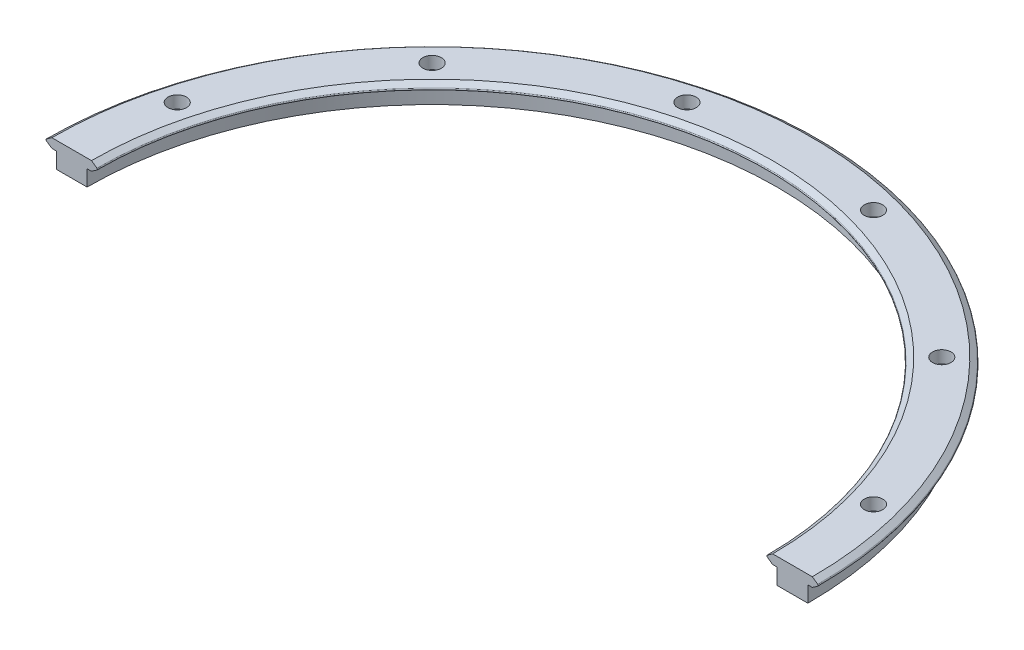
ISO-10303-21;
HEADER;
FILE_DESCRIPTION(('STEP AP214'),'2;1');
FILE_NAME('part.step','',(''),(''),'','','');
FILE_SCHEMA(('AUTOMOTIVE_DESIGN { 1 0 10303 214 1 1 1 1 }'));
ENDSEC;
DATA;
#1=APPLICATION_CONTEXT('core data for automotive mechanical design processes');
#2=APPLICATION_PROTOCOL_DEFINITION('international standard','automotive_design',2000,#1);
#3=PRODUCT_CONTEXT('',#1,'mechanical');
#4=PRODUCT('Part','Part','',(#3));
#5=PRODUCT_RELATED_PRODUCT_CATEGORY('part','',(#4));
#6=PRODUCT_DEFINITION_FORMATION('','',#4);
#7=PRODUCT_DEFINITION_CONTEXT('part definition',#1,'design');
#8=PRODUCT_DEFINITION('design','',#6,#7);
#9=PRODUCT_DEFINITION_SHAPE('','',#8);
#10=(LENGTH_UNIT() NAMED_UNIT(*) SI_UNIT(.MILLI.,.METRE.));
#11=(NAMED_UNIT(*) PLANE_ANGLE_UNIT() SI_UNIT($,.RADIAN.));
#12=(NAMED_UNIT(*) SI_UNIT($,.STERADIAN.) SOLID_ANGLE_UNIT());
#13=UNCERTAINTY_MEASURE_WITH_UNIT(LENGTH_MEASURE(1.E-05),#10,'distance_accuracy_value','');
#14=(GEOMETRIC_REPRESENTATION_CONTEXT(3) GLOBAL_UNCERTAINTY_ASSIGNED_CONTEXT((#13)) GLOBAL_UNIT_ASSIGNED_CONTEXT((#10,
#11,#12)) REPRESENTATION_CONTEXT('',''));
#15=CARTESIAN_POINT('',(0.,0.,0.));
#16=DIRECTION('',(0.,0.,1.));
#17=DIRECTION('',(1.,0.,0.));
#18=AXIS2_PLACEMENT_3D('',#15,#16,#17);
#19=CARTESIAN_POINT('',(0.,0.409576022144497,0.));
#20=DIRECTION('',(0.,-1.,0.));
#21=DIRECTION('',(0.,0.,-1.));
#22=AXIS2_PLACEMENT_3D('',#19,#20,#21);
#23=CONICAL_SURFACE('',#22,187.785064820365,0.959931088596874);
#24=DIRECTION('',(0.819152044288987,-0.573576436351052,0.));
#25=VECTOR('',#24,1.);
#26=CARTESIAN_POINT('',(0.,131.898093972565,0.));
#27=LINE('',#26,#25);
#28=CARTESIAN_POINT('',(187.785064820365,0.409576022144497,0.));
#29=VERTEX_POINT('',#28);
#30=CARTESIAN_POINT('',(185.15666698483,2.25000000000001,0.));
#31=VERTEX_POINT('',#30);
#32=EDGE_CURVE('E121',#29,#31,#27,.F.);
#33=ORIENTED_EDGE('',*,*,#32,.F.);
#34=CARTESIAN_POINT('',(0.,0.409576022144497,0.));
#35=DIRECTION('',(0.,-1.,0.));
#36=DIRECTION('',(0.,0.,-1.));
#37=AXIS2_PLACEMENT_3D('',#34,#35,#36);
#38=CIRCLE('',#37,187.785064820365);
#39=CARTESIAN_POINT('',(-187.785064820365,0.409576022144497,0.));
#40=VERTEX_POINT('',#39);
#41=EDGE_CURVE('E155',#40,#29,#38,.T.);
#42=ORIENTED_EDGE('',*,*,#41,.F.);
#43=DIRECTION('',(0.819152044288987,0.573576436351052,0.));
#44=VECTOR('',#43,1.);
#45=CARTESIAN_POINT('',(0.,131.898093972565,0.));
#46=LINE('',#45,#44);
#47=CARTESIAN_POINT('',(-185.15666698483,2.25000000000001,0.));
#48=VERTEX_POINT('',#47);
#49=EDGE_CURVE('E146',#48,#40,#46,.F.);
#50=ORIENTED_EDGE('',*,*,#49,.F.);
#51=CARTESIAN_POINT('',(0.,2.25000000000001,0.));
#52=DIRECTION('',(0.,-1.,0.));
#53=DIRECTION('',(0.,0.,-1.));
#54=AXIS2_PLACEMENT_3D('',#51,#52,#53);
#55=CIRCLE('',#54,185.15666698483);
#56=EDGE_CURVE('E140',#48,#31,#55,.T.);
#57=ORIENTED_EDGE('',*,*,#56,.T.);
#58=EDGE_LOOP('',(#33,#42,#50,#57));
#59=FACE_BOUND('',#58,.T.);
#60=ADVANCED_FACE('F36',(#59),#23,.T.);
#61=CARTESIAN_POINT('',(185.15666698483,2.25000000000001,0.));
#62=DIRECTION('',(0.,1.,0.));
#63=DIRECTION('',(0.,0.,1.));
#64=AXIS2_PLACEMENT_3D('',#61,#62,#63);
#65=PLANE('',#64);
#66=DIRECTION('',(-1.,0.,0.));
#67=VECTOR('',#66,1.);
#68=CARTESIAN_POINT('',(-255.109513285926,2.25000000000001,0.));
#69=LINE('',#68,#67);
#70=CARTESIAN_POINT('',(165.84333301517,2.25000000000001,0.));
#71=VERTEX_POINT('',#70);
#72=EDGE_CURVE('E124',#31,#71,#69,.T.);
#73=ORIENTED_EDGE('',*,*,#72,.F.);
#74=ORIENTED_EDGE('',*,*,#56,.F.);
#75=CARTESIAN_POINT('',(-165.84333301517,2.25000000000001,0.));
#76=VERTEX_POINT('',#75);
#77=EDGE_CURVE('E143',#76,#48,#69,.T.);
#78=ORIENTED_EDGE('',*,*,#77,.F.);
#79=CARTESIAN_POINT('',(0.,2.24999999999999,0.));
#80=DIRECTION('',(0.,-1.,0.));
#81=DIRECTION('',(0.,0.,-1.));
#82=AXIS2_PLACEMENT_3D('',#79,#80,#81);
#83=CIRCLE('',#82,165.84333301517);
#84=EDGE_CURVE('E142',#76,#71,#83,.T.);
#85=ORIENTED_EDGE('',*,*,#84,.T.);
#86=EDGE_LOOP('',(#73,#74,#78,#85));
#87=FACE_BOUND('',#86,.T.);
#88=CARTESIAN_POINT('',(-45.4227424154918,2.25000000000001,-169.519982513732));
#89=DIRECTION('',(0.,1.,0.));
#90=DIRECTION('',(0.,0.,1.));
#91=AXIS2_PLACEMENT_3D('',#88,#89,#90);
#92=CIRCLE('',#91,4.5);
#93=CARTESIAN_POINT('',(-45.4227424154918,2.25000000000001,-165.019982513732));
#94=VERTEX_POINT('',#93);
#95=EDGE_CURVE('E438',#94,#94,#92,.T.);
#96=ORIENTED_EDGE('',*,*,#95,.F.);
#97=EDGE_LOOP('',(#96));
#98=FACE_BOUND('',#97,.T.);
#99=CARTESIAN_POINT('',(-124.097240098239,2.25000000000001,-124.097240098239));
#100=DIRECTION('',(0.,1.,0.));
#101=DIRECTION('',(0.,0.,1.));
#102=AXIS2_PLACEMENT_3D('',#99,#100,#101);
#103=CIRCLE('',#102,4.5);
#104=CARTESIAN_POINT('',(-124.097240098239,2.25000000000001,-119.597240098239));
#105=VERTEX_POINT('',#104);
#106=EDGE_CURVE('E450',#105,#105,#103,.T.);
#107=ORIENTED_EDGE('',*,*,#106,.F.);
#108=EDGE_LOOP('',(#107));
#109=FACE_BOUND('',#108,.T.);
#110=CARTESIAN_POINT('',(-169.519982513731,2.25000000000001,-45.4227424154926));
#111=DIRECTION('',(0.,1.,0.));
#112=DIRECTION('',(0.,0.,1.));
#113=AXIS2_PLACEMENT_3D('',#110,#111,#112);
#114=CIRCLE('',#113,4.5);
#115=CARTESIAN_POINT('',(-169.519982513731,2.25000000000001,-40.9227424154926));
#116=VERTEX_POINT('',#115);
#117=EDGE_CURVE('E462',#116,#116,#114,.T.);
#118=ORIENTED_EDGE('',*,*,#117,.F.);
#119=EDGE_LOOP('',(#118));
#120=FACE_BOUND('',#119,.T.);
#121=CARTESIAN_POINT('',(45.4227424154918,2.25000000000001,-169.519982513732));
#122=DIRECTION('',(0.,1.,0.));
#123=DIRECTION('',(0.,0.,1.));
#124=AXIS2_PLACEMENT_3D('',#121,#122,#123);
#125=CIRCLE('',#124,4.5);
#126=CARTESIAN_POINT('',(45.4227424154918,2.25000000000001,-165.019982513732));
#127=VERTEX_POINT('',#126);
#128=EDGE_CURVE('E474',#127,#127,#125,.T.);
#129=ORIENTED_EDGE('',*,*,#128,.F.);
#130=EDGE_LOOP('',(#129));
#131=FACE_BOUND('',#130,.T.);
#132=CARTESIAN_POINT('',(124.097240098239,2.25000000000001,-124.097240098239));
#133=DIRECTION('',(0.,1.,0.));
#134=DIRECTION('',(0.,0.,1.));
#135=AXIS2_PLACEMENT_3D('',#132,#133,#134);
#136=CIRCLE('',#135,4.49999999999999);
#137=CARTESIAN_POINT('',(124.097240098239,2.25000000000001,-119.597240098239));
#138=VERTEX_POINT('',#137);
#139=EDGE_CURVE('E486',#138,#138,#136,.T.);
#140=ORIENTED_EDGE('',*,*,#139,.F.);
#141=EDGE_LOOP('',(#140));
#142=FACE_BOUND('',#141,.T.);
#143=CARTESIAN_POINT('',(169.519982513731,2.25000000000001,-45.4227424154926));
#144=DIRECTION('',(0.,1.,0.));
#145=DIRECTION('',(0.,0.,1.));
#146=AXIS2_PLACEMENT_3D('',#143,#144,#145);
#147=CIRCLE('',#146,4.5);
#148=CARTESIAN_POINT('',(169.519982513731,2.25000000000001,-40.9227424154926));
#149=VERTEX_POINT('',#148);
#150=EDGE_CURVE('E387',#149,#149,#147,.T.);
#151=ORIENTED_EDGE('',*,*,#150,.F.);
#152=EDGE_LOOP('',(#151));
#153=FACE_BOUND('',#152,.T.);
#154=ADVANCED_FACE('F137',(#87,#98,#109,#120,#131,#142,#153),#65,.T.);
#155=CARTESIAN_POINT('',(0.,-2.25,0.));
#156=DIRECTION('',(0.,-1.,0.));
#157=DIRECTION('',(0.,0.,-1.));
#158=AXIS2_PLACEMENT_3D('',#155,#156,#157);
#159=PLANE('',#158);
#160=DIRECTION('',(1.,0.,0.));
#161=VECTOR('',#160,1.);
#162=CARTESIAN_POINT('',(0.,-2.25,0.));
#163=LINE('',#162,#161);
#164=CARTESIAN_POINT('',(-185.15666698483,-2.25,0.));
#165=VERTEX_POINT('',#164);
#166=CARTESIAN_POINT('',(-183.,-2.25,0.));
#167=VERTEX_POINT('',#166);
#168=EDGE_CURVE('E416',#165,#167,#163,.T.);
#169=ORIENTED_EDGE('',*,*,#168,.F.);
#170=CARTESIAN_POINT('',(0.,-2.25,0.));
#171=DIRECTION('',(0.,-1.,0.));
#172=DIRECTION('',(0.,0.,-1.));
#173=AXIS2_PLACEMENT_3D('',#170,#171,#172);
#174=CIRCLE('',#173,185.15666698483);
#175=CARTESIAN_POINT('',(185.15666698483,-2.25,0.));
#176=VERTEX_POINT('',#175);
#177=EDGE_CURVE('E147',#165,#176,#174,.T.);
#178=ORIENTED_EDGE('',*,*,#177,.T.);
#179=CARTESIAN_POINT('',(183.,-2.25,0.));
#180=VERTEX_POINT('',#179);
#181=EDGE_CURVE('E418',#180,#176,#163,.T.);
#182=ORIENTED_EDGE('',*,*,#181,.F.);
#183=CARTESIAN_POINT('',(0.,-2.25,0.));
#184=DIRECTION('',(0.,-1.,0.));
#185=DIRECTION('',(0.,0.,-1.));
#186=AXIS2_PLACEMENT_3D('',#183,#184,#185);
#187=CIRCLE('',#186,183.);
#188=EDGE_CURVE('E162',#167,#180,#187,.T.);
#189=ORIENTED_EDGE('',*,*,#188,.F.);
#190=EDGE_LOOP('',(#169,#178,#182,#189));
#191=FACE_BOUND('',#190,.T.);
#192=ADVANCED_FACE('F178',(#191),#159,.T.);
#193=CARTESIAN_POINT('',(0.,-2.25,0.));
#194=DIRECTION('',(0.,1.,0.));
#195=DIRECTION('',(0.,0.,1.));
#196=AXIS2_PLACEMENT_3D('',#193,#194,#195);
#197=CONICAL_SURFACE('',#196,185.15666698483,0.959931088596875);
#198=DIRECTION('',(-0.819152044288988,0.573576436351051,0.));
#199=VECTOR('',#198,1.);
#200=CARTESIAN_POINT('',(0.,-131.898093972565,0.));
#201=LINE('',#200,#199);
#202=CARTESIAN_POINT('',(-187.785064820365,-0.409576022144503,0.));
#203=VERTEX_POINT('',#202);
#204=EDGE_CURVE('E425',#203,#165,#201,.F.);
#205=ORIENTED_EDGE('',*,*,#204,.F.);
#206=CARTESIAN_POINT('',(0.,-0.409576022144495,0.));
#207=DIRECTION('',(0.,-1.,0.));
#208=DIRECTION('',(0.,0.,-1.));
#209=AXIS2_PLACEMENT_3D('',#206,#207,#208);
#210=CIRCLE('',#209,187.785064820365);
#211=CARTESIAN_POINT('',(187.785064820365,-0.409576022144503,0.));
#212=VERTEX_POINT('',#211);
#213=EDGE_CURVE('E150',#203,#212,#210,.T.);
#214=ORIENTED_EDGE('',*,*,#213,.T.);
#215=DIRECTION('',(-0.819152044288988,-0.573576436351051,0.));
#216=VECTOR('',#215,1.);
#217=CARTESIAN_POINT('',(0.,-131.898093972565,0.));
#218=LINE('',#217,#216);
#219=EDGE_CURVE('E420',#176,#212,#218,.F.);
#220=ORIENTED_EDGE('',*,*,#219,.F.);
#221=ORIENTED_EDGE('',*,*,#177,.F.);
#222=EDGE_LOOP('',(#205,#214,#220,#221));
#223=FACE_BOUND('',#222,.T.);
#224=ADVANCED_FACE('F173',(#223),#197,.T.);
#225=CARTESIAN_POINT('',(187.785064820365,-0.409576022144494,0.));
#226=CARTESIAN_POINT('',(187.816805619239,-0.387350875504388,0.));
#227=CARTESIAN_POINT('',(187.846140091058,-0.36123735765941,0.));
#228=CARTESIAN_POINT('',(187.871890970479,-0.332283469055054,0.));
#229=CARTESIAN_POINT('',(187.90908139591,-0.290467132711145,0.));
#230=CARTESIAN_POINT('',(187.939565048451,-0.241653141764968,0.));
#231=CARTESIAN_POINT('',(187.960817563583,-0.189883804030459,0.));
#232=CARTESIAN_POINT('',(187.982070078715,-0.138114466295951,0.));
#233=CARTESIAN_POINT('',(187.994677627045,-0.0819619195195737,0.));
#234=CARTESIAN_POINT('',(187.997596172014,-0.0260761805142874,0.));
#235=CARTESIAN_POINT('',(188.000514716983,0.0298095584909946,0.));
#236=CARTESIAN_POINT('',(187.993824755665,0.0869698874082328,0.));
#237=CARTESIAN_POINT('',(187.978080286665,0.140671334547221,0.));
#238=CARTESIAN_POINT('',(187.962335817666,0.19437278168486,0.));
#239=CARTESIAN_POINT('',(187.937102589091,0.246096499260798,0.));
#240=CARTESIAN_POINT('',(187.90447017557,0.291559223733971,0.));
#241=CARTESIAN_POINT('',(187.871837762049,0.33702194820714,0.));
#242=CARTESIAN_POINT('',(187.830906121325,0.377477597650591,0.));
#243=CARTESIAN_POINT('',(187.785064820365,0.409576022144497,0.));
#244=B_SPLINE_CURVE_WITH_KNOTS('',3,(#225,#226,#227,#228,#229,#230,#231,#232,#233,#234,#235,
#236,#237,#238,#239,#240,#241,#242,#243),.UNSPECIFIED.,.F.,.F.,(4,3,3,3,3,3,4),(0.,
0.000115377347826541,0.000283263033816064,0.00045114871980559,0.000619034405795105,
0.000786920091780279,0.000954805777765429),.UNSPECIFIED.);
#245=CARTESIAN_POINT('',(0.,2.25000000000001,0.));
#246=DIRECTION('',(0.,-1.,0.));
#247=AXIS1_PLACEMENT('',#245,#246);
#248=SURFACE_OF_REVOLUTION('',#244,#247);
#249=CARTESIAN_POINT('',(187.785064820365,-0.409576022144494,0.));
#250=CARTESIAN_POINT('',(187.816805619239,-0.387350875504388,0.));
#251=CARTESIAN_POINT('',(187.846140091058,-0.36123735765941,0.));
#252=CARTESIAN_POINT('',(187.871890970479,-0.332283469055054,0.));
#253=CARTESIAN_POINT('',(187.90908139591,-0.290467132711145,0.));
#254=CARTESIAN_POINT('',(187.939565048451,-0.241653141764968,0.));
#255=CARTESIAN_POINT('',(187.960817563583,-0.189883804030459,0.));
#256=CARTESIAN_POINT('',(187.982070078715,-0.138114466295951,0.));
#257=CARTESIAN_POINT('',(187.994677627045,-0.0819619195195737,0.));
#258=CARTESIAN_POINT('',(187.997596172014,-0.0260761805142874,0.));
#259=CARTESIAN_POINT('',(188.000514716983,0.0298095584909946,0.));
#260=CARTESIAN_POINT('',(187.993824755665,0.0869698874082328,0.));
#261=CARTESIAN_POINT('',(187.978080286665,0.140671334547221,0.));
#262=CARTESIAN_POINT('',(187.962335817666,0.19437278168486,0.));
#263=CARTESIAN_POINT('',(187.937102589091,0.246096499260798,0.));
#264=CARTESIAN_POINT('',(187.90447017557,0.291559223733971,0.));
#265=CARTESIAN_POINT('',(187.871837762049,0.33702194820714,0.));
#266=CARTESIAN_POINT('',(187.830906121325,0.377477597650591,0.));
#267=CARTESIAN_POINT('',(187.785064820365,0.409576022144497,0.));
#268=B_SPLINE_CURVE_WITH_KNOTS('',3,(#249,#250,#251,#252,#253,#254,#255,#256,#257,#258,#259,
#260,#261,#262,#263,#264,#265,#266,#267),.UNSPECIFIED.,.F.,.F.,(4,3,3,3,3,3,4),(0.,
0.000115377347826541,0.000283263033816064,0.00045114871980559,0.000619034405795105,
0.000786920091780279,0.000954805777765429),.UNSPECIFIED.);
#269=EDGE_CURVE('E127',#212,#29,#268,.T.);
#270=ORIENTED_EDGE('',*,*,#269,.F.);
#271=ORIENTED_EDGE('',*,*,#213,.F.);
#272=CARTESIAN_POINT('',(-187.785064820365,-0.409576022144494,0.));
#273=CARTESIAN_POINT('',(-187.816805619239,-0.387350875504388,0.));
#274=CARTESIAN_POINT('',(-187.846140091058,-0.36123735765941,0.));
#275=CARTESIAN_POINT('',(-187.871890970479,-0.332283469055054,0.));
#276=CARTESIAN_POINT('',(-187.90908139591,-0.290467132711145,0.));
#277=CARTESIAN_POINT('',(-187.939565048451,-0.241653141764968,0.));
#278=CARTESIAN_POINT('',(-187.960817563583,-0.189883804030459,0.));
#279=CARTESIAN_POINT('',(-187.982070078715,-0.138114466295951,0.));
#280=CARTESIAN_POINT('',(-187.994677627045,-0.0819619195195737,0.));
#281=CARTESIAN_POINT('',(-187.997596172014,-0.0260761805142874,0.));
#282=CARTESIAN_POINT('',(-188.000514716983,0.0298095584909946,0.));
#283=CARTESIAN_POINT('',(-187.993824755665,0.0869698874082328,0.));
#284=CARTESIAN_POINT('',(-187.978080286665,0.140671334547221,0.));
#285=CARTESIAN_POINT('',(-187.962335817666,0.19437278168486,0.));
#286=CARTESIAN_POINT('',(-187.937102589091,0.246096499260798,0.));
#287=CARTESIAN_POINT('',(-187.90447017557,0.291559223733971,0.));
#288=CARTESIAN_POINT('',(-187.871837762049,0.33702194820714,0.));
#289=CARTESIAN_POINT('',(-187.830906121325,0.377477597650591,0.));
#290=CARTESIAN_POINT('',(-187.785064820365,0.409576022144497,0.));
#291=B_SPLINE_CURVE_WITH_KNOTS('',3,(#272,#273,#274,#275,#276,#277,#278,#279,#280,#281,#282,
#283,#284,#285,#286,#287,#288,#289,#290),.UNSPECIFIED.,.F.,.F.,(4,3,3,3,3,3,4),(0.,
0.000115377347826541,0.000283263033816064,0.00045114871980559,0.000619034405795105,
0.000786920091780279,0.000954805777765429),.UNSPECIFIED.);
#292=EDGE_CURVE('E426',#40,#203,#291,.F.);
#293=ORIENTED_EDGE('',*,*,#292,.F.);
#294=ORIENTED_EDGE('',*,*,#41,.T.);
#295=EDGE_LOOP('',(#270,#271,#293,#294));
#296=FACE_BOUND('',#295,.T.);
#297=ADVANCED_FACE('F168',(#296),#248,.F.);
#298=CARTESIAN_POINT('',(0.,-9.99999999999999,0.));
#299=DIRECTION('',(0.,1.,0.));
#300=DIRECTION('',(0.,0.,1.));
#301=AXIS2_PLACEMENT_3D('',#298,#299,#300);
#302=CYLINDRICAL_SURFACE('',#301,183.);
#303=CARTESIAN_POINT('',(0.,-9.99999999999999,0.));
#304=DIRECTION('',(0.,-1.,0.));
#305=DIRECTION('',(0.,0.,-1.));
#306=AXIS2_PLACEMENT_3D('',#303,#304,#305);
#307=CIRCLE('',#306,183.);
#308=CARTESIAN_POINT('',(-183.,-10.,0.));
#309=VERTEX_POINT('',#308);
#310=CARTESIAN_POINT('',(183.,-10.,0.));
#311=VERTEX_POINT('',#310);
#312=EDGE_CURVE('E157',#309,#311,#307,.T.);
#313=ORIENTED_EDGE('',*,*,#312,.F.);
#314=DIRECTION('',(0.,1.,0.));
#315=VECTOR('',#314,1.);
#316=CARTESIAN_POINT('',(-183.,-9.99999999999999,0.));
#317=LINE('',#316,#315);
#318=EDGE_CURVE('E132',#309,#167,#317,.T.);
#319=ORIENTED_EDGE('',*,*,#318,.T.);
#320=ORIENTED_EDGE('',*,*,#188,.T.);
#321=DIRECTION('',(0.,1.,0.));
#322=VECTOR('',#321,1.);
#323=CARTESIAN_POINT('',(183.,-9.99999999999999,0.));
#324=LINE('',#323,#322);
#325=EDGE_CURVE('E413',#180,#311,#324,.F.);
#326=ORIENTED_EDGE('',*,*,#325,.T.);
#327=EDGE_LOOP('',(#313,#319,#320,#326));
#328=FACE_BOUND('',#327,.T.);
#329=ADVANCED_FACE('F172',(#328),#302,.T.);
#330=CARTESIAN_POINT('',(0.,-9.99999999999999,0.));
#331=DIRECTION('',(0.,-1.,0.));
#332=DIRECTION('',(0.,0.,-1.));
#333=AXIS2_PLACEMENT_3D('',#330,#331,#332);
#334=PLANE('',#333);
#335=DIRECTION('',(-1.,0.,0.));
#336=VECTOR('',#335,1.);
#337=CARTESIAN_POINT('',(-255.109513285926,-10.,0.));
#338=LINE('',#337,#336);
#339=CARTESIAN_POINT('',(-168.,-9.99999999999999,0.));
#340=VERTEX_POINT('',#339);
#341=EDGE_CURVE('E50',#340,#309,#338,.T.);
#342=ORIENTED_EDGE('',*,*,#341,.T.);
#343=ORIENTED_EDGE('',*,*,#312,.T.);
#344=CARTESIAN_POINT('',(168.,-10.,0.));
#345=VERTEX_POINT('',#344);
#346=EDGE_CURVE('E562',#311,#345,#338,.T.);
#347=ORIENTED_EDGE('',*,*,#346,.T.);
#348=CARTESIAN_POINT('',(0.,-9.99999999999999,0.));
#349=DIRECTION('',(0.,-1.,0.));
#350=DIRECTION('',(0.,0.,-1.));
#351=AXIS2_PLACEMENT_3D('',#348,#349,#350);
#352=CIRCLE('',#351,168.);
#353=EDGE_CURVE('E392',#340,#345,#352,.T.);
#354=ORIENTED_EDGE('',*,*,#353,.F.);
#355=EDGE_LOOP('',(#342,#343,#347,#354));
#356=FACE_BOUND('',#355,.T.);
#357=CARTESIAN_POINT('',(-45.4227424154918,-10.,-169.519982513732));
#358=DIRECTION('',(0.,1.,0.));
#359=DIRECTION('',(0.,0.,1.));
#360=AXIS2_PLACEMENT_3D('',#357,#358,#359);
#361=CIRCLE('',#360,2.75000000000001);
#362=CARTESIAN_POINT('',(-45.4227424154918,-10.,-166.769982513732));
#363=VERTEX_POINT('',#362);
#364=EDGE_CURVE('E447',#363,#363,#361,.T.);
#365=ORIENTED_EDGE('',*,*,#364,.T.);
#366=EDGE_LOOP('',(#365));
#367=FACE_BOUND('',#366,.T.);
#368=CARTESIAN_POINT('',(-124.097240098239,-10.,-124.097240098239));
#369=DIRECTION('',(0.,1.,0.));
#370=DIRECTION('',(0.,0.,1.));
#371=AXIS2_PLACEMENT_3D('',#368,#369,#370);
#372=CIRCLE('',#371,2.75000000000002);
#373=CARTESIAN_POINT('',(-124.097240098239,-10.,-121.347240098239));
#374=VERTEX_POINT('',#373);
#375=EDGE_CURVE('E459',#374,#374,#372,.T.);
#376=ORIENTED_EDGE('',*,*,#375,.T.);
#377=EDGE_LOOP('',(#376));
#378=FACE_BOUND('',#377,.T.);
#379=CARTESIAN_POINT('',(-169.519982513731,-10.,-45.4227424154926));
#380=DIRECTION('',(0.,1.,0.));
#381=DIRECTION('',(0.,0.,1.));
#382=AXIS2_PLACEMENT_3D('',#379,#380,#381);
#383=CIRCLE('',#382,2.75);
#384=CARTESIAN_POINT('',(-169.519982513731,-10.,-42.6727424154926));
#385=VERTEX_POINT('',#384);
#386=EDGE_CURVE('E471',#385,#385,#383,.T.);
#387=ORIENTED_EDGE('',*,*,#386,.T.);
#388=EDGE_LOOP('',(#387));
#389=FACE_BOUND('',#388,.T.);
#390=CARTESIAN_POINT('',(45.4227424154918,-10.,-169.519982513732));
#391=DIRECTION('',(0.,1.,0.));
#392=DIRECTION('',(0.,0.,1.));
#393=AXIS2_PLACEMENT_3D('',#390,#391,#392);
#394=CIRCLE('',#393,2.75000000000001);
#395=CARTESIAN_POINT('',(45.4227424154918,-10.,-166.769982513732));
#396=VERTEX_POINT('',#395);
#397=EDGE_CURVE('E483',#396,#396,#394,.T.);
#398=ORIENTED_EDGE('',*,*,#397,.T.);
#399=EDGE_LOOP('',(#398));
#400=FACE_BOUND('',#399,.T.);
#401=CARTESIAN_POINT('',(124.097240098239,-10.,-124.097240098239));
#402=DIRECTION('',(0.,1.,0.));
#403=DIRECTION('',(0.,0.,1.));
#404=AXIS2_PLACEMENT_3D('',#401,#402,#403);
#405=CIRCLE('',#404,2.75000000000002);
#406=CARTESIAN_POINT('',(124.097240098239,-10.,-121.347240098239));
#407=VERTEX_POINT('',#406);
#408=EDGE_CURVE('E495',#407,#407,#405,.T.);
#409=ORIENTED_EDGE('',*,*,#408,.T.);
#410=EDGE_LOOP('',(#409));
#411=FACE_BOUND('',#410,.T.);
#412=CARTESIAN_POINT('',(169.519982513731,-10.,-45.4227424154926));
#413=DIRECTION('',(0.,1.,0.));
#414=DIRECTION('',(0.,0.,1.));
#415=AXIS2_PLACEMENT_3D('',#412,#413,#414);
#416=CIRCLE('',#415,2.75);
#417=CARTESIAN_POINT('',(169.519982513731,-10.,-42.6727424154926));
#418=VERTEX_POINT('',#417);
#419=EDGE_CURVE('E379',#418,#418,#416,.T.);
#420=ORIENTED_EDGE('',*,*,#419,.T.);
#421=EDGE_LOOP('',(#420));
#422=FACE_BOUND('',#421,.T.);
#423=ADVANCED_FACE('F225',(#356,#367,#378,#389,#400,#411,#422),#334,.T.);
#424=CARTESIAN_POINT('',(0.,0.409576022144502,0.));
#425=DIRECTION('',(0.,1.,0.));
#426=DIRECTION('',(0.,0.,1.));
#427=AXIS2_PLACEMENT_3D('',#424,#425,#426);
#428=CONICAL_SURFACE('',#427,163.214935179635,0.959931088596886);
#429=ORIENTED_EDGE('',*,*,#84,.F.);
#430=DIRECTION('',(-0.819152044288994,0.573576436351043,0.));
#431=VECTOR('',#430,1.);
#432=CARTESIAN_POINT('',(0.,-113.874751939044,0.));
#433=LINE('',#432,#431);
#434=CARTESIAN_POINT('',(-163.214935179635,0.409576022144502,0.));
#435=VERTEX_POINT('',#434);
#436=EDGE_CURVE('E555',#76,#435,#433,.F.);
#437=ORIENTED_EDGE('',*,*,#436,.T.);
#438=CARTESIAN_POINT('',(0.,0.409576022144502,0.));
#439=DIRECTION('',(0.,-1.,0.));
#440=DIRECTION('',(0.,0.,-1.));
#441=AXIS2_PLACEMENT_3D('',#438,#439,#440);
#442=CIRCLE('',#441,163.214935179635);
#443=CARTESIAN_POINT('',(163.214935179635,0.409576022144502,0.));
#444=VERTEX_POINT('',#443);
#445=EDGE_CURVE('E404',#435,#444,#442,.T.);
#446=ORIENTED_EDGE('',*,*,#445,.T.);
#447=DIRECTION('',(-0.819152044288994,-0.573576436351043,0.));
#448=VECTOR('',#447,1.);
#449=CARTESIAN_POINT('',(0.,-113.874751939044,0.));
#450=LINE('',#449,#448);
#451=EDGE_CURVE('E423',#444,#71,#450,.F.);
#452=ORIENTED_EDGE('',*,*,#451,.T.);
#453=EDGE_LOOP('',(#429,#437,#446,#452));
#454=FACE_BOUND('',#453,.T.);
#455=ADVANCED_FACE('F234',(#454),#428,.F.);
#456=CARTESIAN_POINT('',(0.,0.,0.));
#457=DIRECTION('',(0.,-1.,0.));
#458=DIRECTION('',(0.,0.,-1.));
#459=AXIS2_PLACEMENT_3D('',#456,#457,#458);
#460=TOROIDAL_SURFACE('',#459,163.501723397811,0.499999999999988);
#461=CARTESIAN_POINT('',(0.,-0.409576022144503,0.));
#462=DIRECTION('',(0.,-1.,0.));
#463=DIRECTION('',(0.,0.,-1.));
#464=AXIS2_PLACEMENT_3D('',#461,#462,#463);
#465=CIRCLE('',#464,163.214935179635);
#466=CARTESIAN_POINT('',(-163.214935179635,-0.409576022144503,0.));
#467=VERTEX_POINT('',#466);
#468=CARTESIAN_POINT('',(163.214935179635,-0.409576022144503,0.));
#469=VERTEX_POINT('',#468);
#470=EDGE_CURVE('E401',#467,#469,#465,.T.);
#471=ORIENTED_EDGE('',*,*,#470,.T.);
#472=CARTESIAN_POINT('',(163.501723397811,0.,0.));
#473=DIRECTION('',(0.,0.,-1.));
#474=DIRECTION('',(-1.,0.,0.));
#475=AXIS2_PLACEMENT_3D('',#472,#473,#474);
#476=CIRCLE('',#475,0.499999999999988);
#477=EDGE_CURVE('E572',#469,#444,#476,.T.);
#478=ORIENTED_EDGE('',*,*,#477,.T.);
#479=ORIENTED_EDGE('',*,*,#445,.F.);
#480=CARTESIAN_POINT('',(-163.501723397811,0.,0.));
#481=DIRECTION('',(0.,0.,-1.));
#482=DIRECTION('',(-1.,0.,0.));
#483=AXIS2_PLACEMENT_3D('',#480,#481,#482);
#484=CIRCLE('',#483,0.499999999999988);
#485=EDGE_CURVE('E565',#435,#467,#484,.T.);
#486=ORIENTED_EDGE('',*,*,#485,.T.);
#487=EDGE_LOOP('',(#471,#478,#479,#486));
#488=FACE_BOUND('',#487,.T.);
#489=ADVANCED_FACE('F243',(#488),#460,.T.);
#490=CARTESIAN_POINT('',(0.,-2.25000000000001,0.));
#491=DIRECTION('',(0.,-1.,0.));
#492=DIRECTION('',(0.,0.,-1.));
#493=AXIS2_PLACEMENT_3D('',#490,#491,#492);
#494=CONICAL_SURFACE('',#493,165.84333301517,0.959931088596886);
#495=CARTESIAN_POINT('',(0.,-2.25000000000001,0.));
#496=DIRECTION('',(0.,-1.,0.));
#497=DIRECTION('',(0.,0.,-1.));
#498=AXIS2_PLACEMENT_3D('',#495,#496,#497);
#499=CIRCLE('',#498,165.84333301517);
#500=CARTESIAN_POINT('',(-165.84333301517,-2.25000000000001,0.));
#501=VERTEX_POINT('',#500);
#502=CARTESIAN_POINT('',(165.84333301517,-2.25000000000001,0.));
#503=VERTEX_POINT('',#502);
#504=EDGE_CURVE('E398',#501,#503,#499,.T.);
#505=ORIENTED_EDGE('',*,*,#504,.T.);
#506=DIRECTION('',(0.819152044288994,-0.573576436351042,0.));
#507=VECTOR('',#506,1.);
#508=CARTESIAN_POINT('',(0.,113.874751939044,0.));
#509=LINE('',#508,#507);
#510=EDGE_CURVE('E569',#503,#469,#509,.F.);
#511=ORIENTED_EDGE('',*,*,#510,.T.);
#512=ORIENTED_EDGE('',*,*,#470,.F.);
#513=DIRECTION('',(0.819152044288994,0.573576436351042,0.));
#514=VECTOR('',#513,1.);
#515=CARTESIAN_POINT('',(0.,113.874751939044,0.));
#516=LINE('',#515,#514);
#517=EDGE_CURVE('E561',#467,#501,#516,.F.);
#518=ORIENTED_EDGE('',*,*,#517,.T.);
#519=EDGE_LOOP('',(#505,#511,#512,#518));
#520=FACE_BOUND('',#519,.T.);
#521=ADVANCED_FACE('F253',(#520),#494,.F.);
#522=CARTESIAN_POINT('',(168.,-2.25,0.));
#523=DIRECTION('',(0.,1.,0.));
#524=DIRECTION('',(0.,0.,1.));
#525=AXIS2_PLACEMENT_3D('',#522,#523,#524);
#526=PLANE('',#525);
#527=CARTESIAN_POINT('',(0.,-2.25,0.));
#528=DIRECTION('',(0.,-1.,0.));
#529=DIRECTION('',(0.,0.,-1.));
#530=AXIS2_PLACEMENT_3D('',#527,#528,#529);
#531=CIRCLE('',#530,168.);
#532=CARTESIAN_POINT('',(-168.,-2.25,0.));
#533=VERTEX_POINT('',#532);
#534=CARTESIAN_POINT('',(168.,-2.25,0.));
#535=VERTEX_POINT('',#534);
#536=EDGE_CURVE('E395',#533,#535,#531,.T.);
#537=ORIENTED_EDGE('',*,*,#536,.T.);
#538=DIRECTION('',(-1.,0.,0.));
#539=VECTOR('',#538,1.);
#540=CARTESIAN_POINT('',(168.,-2.25,0.));
#541=LINE('',#540,#539);
#542=EDGE_CURVE('E58',#535,#503,#541,.T.);
#543=ORIENTED_EDGE('',*,*,#542,.T.);
#544=ORIENTED_EDGE('',*,*,#504,.F.);
#545=EDGE_CURVE('E558',#501,#533,#541,.T.);
#546=ORIENTED_EDGE('',*,*,#545,.T.);
#547=EDGE_LOOP('',(#537,#543,#544,#546));
#548=FACE_BOUND('',#547,.T.);
#549=ADVANCED_FACE('F263',(#548),#526,.F.);
#550=CARTESIAN_POINT('',(0.,2.24999999999999,0.));
#551=DIRECTION('',(0.,-1.,0.));
#552=DIRECTION('',(0.,0.,-1.));
#553=AXIS2_PLACEMENT_3D('',#550,#551,#552);
#554=CYLINDRICAL_SURFACE('',#553,168.);
#555=ORIENTED_EDGE('',*,*,#353,.T.);
#556=DIRECTION('',(0.,-1.,0.));
#557=VECTOR('',#556,1.);
#558=CARTESIAN_POINT('',(168.,2.24999999999999,0.));
#559=LINE('',#558,#557);
#560=EDGE_CURVE('E11',#345,#535,#559,.F.);
#561=ORIENTED_EDGE('',*,*,#560,.T.);
#562=ORIENTED_EDGE('',*,*,#536,.F.);
#563=DIRECTION('',(0.,-1.,0.));
#564=VECTOR('',#563,1.);
#565=CARTESIAN_POINT('',(-168.,2.24999999999999,0.));
#566=LINE('',#565,#564);
#567=EDGE_CURVE('E43',#533,#340,#566,.T.);
#568=ORIENTED_EDGE('',*,*,#567,.T.);
#569=EDGE_LOOP('',(#555,#561,#562,#568));
#570=FACE_BOUND('',#569,.T.);
#571=ADVANCED_FACE('F273',(#570),#554,.F.);
#572=CARTESIAN_POINT('',(169.519982513731,2.25000000000001,-45.4227424154926));
#573=DIRECTION('',(0.,1.,0.));
#574=DIRECTION('',(0.,0.,1.));
#575=AXIS2_PLACEMENT_3D('',#572,#573,#574);
#576=CYLINDRICAL_SURFACE('',#575,2.75);
#577=ORIENTED_EDGE('',*,*,#419,.F.);
#578=EDGE_LOOP('',(#577));
#579=FACE_BOUND('',#578,.T.);
#580=CARTESIAN_POINT('',(169.519982513731,-3.74999999999999,-45.4227424154926));
#581=DIRECTION('',(0.,1.,0.));
#582=DIRECTION('',(0.,0.,1.));
#583=AXIS2_PLACEMENT_3D('',#580,#581,#582);
#584=CIRCLE('',#583,2.75);
#585=CARTESIAN_POINT('',(169.519982513731,-3.74999999999999,-42.6727424154926));
#586=VERTEX_POINT('',#585);
#587=EDGE_CURVE('E382',#586,#586,#584,.T.);
#588=ORIENTED_EDGE('',*,*,#587,.T.);
#589=EDGE_LOOP('',(#588));
#590=FACE_BOUND('',#589,.T.);
#591=ADVANCED_FACE('F283',(#579,#590),#576,.F.);
#592=CARTESIAN_POINT('',(172.269982513731,-3.74999999999999,-45.4227424154926));
#593=DIRECTION('',(0.,-1.,0.));
#594=DIRECTION('',(0.,0.,-1.));
#595=AXIS2_PLACEMENT_3D('',#592,#593,#594);
#596=PLANE('',#595);
#597=ORIENTED_EDGE('',*,*,#587,.F.);
#598=EDGE_LOOP('',(#597));
#599=FACE_BOUND('',#598,.T.);
#600=CARTESIAN_POINT('',(169.519982513731,-3.74999999999999,-45.4227424154926));
#601=DIRECTION('',(0.,1.,0.));
#602=DIRECTION('',(0.,0.,1.));
#603=AXIS2_PLACEMENT_3D('',#600,#601,#602);
#604=CIRCLE('',#603,4.5);
#605=CARTESIAN_POINT('',(169.519982513731,-3.74999999999999,-40.9227424154926));
#606=VERTEX_POINT('',#605);
#607=EDGE_CURVE('E383',#606,#606,#604,.T.);
#608=ORIENTED_EDGE('',*,*,#607,.T.);
#609=EDGE_LOOP('',(#608));
#610=FACE_BOUND('',#609,.T.);
#611=ADVANCED_FACE('F368',(#599,#610),#596,.F.);
#612=CARTESIAN_POINT('',(169.519982513731,2.25000000000001,-45.4227424154926));
#613=DIRECTION('',(0.,1.,0.));
#614=DIRECTION('',(0.,0.,1.));
#615=AXIS2_PLACEMENT_3D('',#612,#613,#614);
#616=CYLINDRICAL_SURFACE('',#615,4.5);
#617=ORIENTED_EDGE('',*,*,#607,.F.);
#618=EDGE_LOOP('',(#617));
#619=FACE_BOUND('',#618,.T.);
#620=ORIENTED_EDGE('',*,*,#150,.T.);
#621=EDGE_LOOP('',(#620));
#622=FACE_BOUND('',#621,.T.);
#623=ADVANCED_FACE('F364',(#619,#622),#616,.F.);
#624=CARTESIAN_POINT('',(124.097240098239,2.25000000000001,-124.097240098239));
#625=DIRECTION('',(0.,1.,0.));
#626=DIRECTION('',(0.,0.,1.));
#627=AXIS2_PLACEMENT_3D('',#624,#625,#626);
#628=CYLINDRICAL_SURFACE('',#627,2.75000000000002);
#629=ORIENTED_EDGE('',*,*,#408,.F.);
#630=EDGE_LOOP('',(#629));
#631=FACE_BOUND('',#630,.T.);
#632=CARTESIAN_POINT('',(124.097240098239,-3.74999999999999,-124.097240098239));
#633=DIRECTION('',(0.,1.,0.));
#634=DIRECTION('',(0.,0.,1.));
#635=AXIS2_PLACEMENT_3D('',#632,#633,#634);
#636=CIRCLE('',#635,2.75000000000002);
#637=CARTESIAN_POINT('',(124.097240098239,-3.74999999999999,-121.347240098239));
#638=VERTEX_POINT('',#637);
#639=EDGE_CURVE('E492',#638,#638,#636,.T.);
#640=ORIENTED_EDGE('',*,*,#639,.T.);
#641=EDGE_LOOP('',(#640));
#642=FACE_BOUND('',#641,.T.);
#643=ADVANCED_FACE('F360',(#631,#642),#628,.F.);
#644=CARTESIAN_POINT('',(126.847240098239,-3.74999999999999,-124.097240098239));
#645=DIRECTION('',(0.,-1.,0.));
#646=DIRECTION('',(0.,0.,-1.));
#647=AXIS2_PLACEMENT_3D('',#644,#645,#646);
#648=PLANE('',#647);
#649=ORIENTED_EDGE('',*,*,#639,.F.);
#650=EDGE_LOOP('',(#649));
#651=FACE_BOUND('',#650,.T.);
#652=CARTESIAN_POINT('',(124.097240098239,-3.74999999999999,-124.097240098239));
#653=DIRECTION('',(0.,1.,0.));
#654=DIRECTION('',(0.,0.,1.));
#655=AXIS2_PLACEMENT_3D('',#652,#653,#654);
#656=CIRCLE('',#655,4.49999999999999);
#657=CARTESIAN_POINT('',(124.097240098239,-3.74999999999999,-119.597240098239));
#658=VERTEX_POINT('',#657);
#659=EDGE_CURVE('E489',#658,#658,#656,.T.);
#660=ORIENTED_EDGE('',*,*,#659,.T.);
#661=EDGE_LOOP('',(#660));
#662=FACE_BOUND('',#661,.T.);
#663=ADVANCED_FACE('F356',(#651,#662),#648,.F.);
#664=CARTESIAN_POINT('',(124.097240098239,2.25000000000001,-124.097240098239));
#665=DIRECTION('',(0.,1.,0.));
#666=DIRECTION('',(0.,0.,1.));
#667=AXIS2_PLACEMENT_3D('',#664,#665,#666);
#668=CYLINDRICAL_SURFACE('',#667,4.49999999999999);
#669=ORIENTED_EDGE('',*,*,#659,.F.);
#670=EDGE_LOOP('',(#669));
#671=FACE_BOUND('',#670,.T.);
#672=ORIENTED_EDGE('',*,*,#139,.T.);
#673=EDGE_LOOP('',(#672));
#674=FACE_BOUND('',#673,.T.);
#675=ADVANCED_FACE('F352',(#671,#674),#668,.F.);
#676=CARTESIAN_POINT('',(45.4227424154918,2.25000000000001,-169.519982513732));
#677=DIRECTION('',(0.,1.,0.));
#678=DIRECTION('',(0.,0.,1.));
#679=AXIS2_PLACEMENT_3D('',#676,#677,#678);
#680=CYLINDRICAL_SURFACE('',#679,2.75000000000001);
#681=ORIENTED_EDGE('',*,*,#397,.F.);
#682=EDGE_LOOP('',(#681));
#683=FACE_BOUND('',#682,.T.);
#684=CARTESIAN_POINT('',(45.4227424154918,-3.74999999999999,-169.519982513732));
#685=DIRECTION('',(0.,1.,0.));
#686=DIRECTION('',(0.,0.,1.));
#687=AXIS2_PLACEMENT_3D('',#684,#685,#686);
#688=CIRCLE('',#687,2.75000000000001);
#689=CARTESIAN_POINT('',(45.4227424154918,-3.74999999999999,-166.769982513732));
#690=VERTEX_POINT('',#689);
#691=EDGE_CURVE('E480',#690,#690,#688,.T.);
#692=ORIENTED_EDGE('',*,*,#691,.T.);
#693=EDGE_LOOP('',(#692));
#694=FACE_BOUND('',#693,.T.);
#695=ADVANCED_FACE('F348',(#683,#694),#680,.F.);
#696=CARTESIAN_POINT('',(48.1727424154918,-3.74999999999999,-169.519982513732));
#697=DIRECTION('',(0.,-1.,0.));
#698=DIRECTION('',(0.,0.,-1.));
#699=AXIS2_PLACEMENT_3D('',#696,#697,#698);
#700=PLANE('',#699);
#701=ORIENTED_EDGE('',*,*,#691,.F.);
#702=EDGE_LOOP('',(#701));
#703=FACE_BOUND('',#702,.T.);
#704=CARTESIAN_POINT('',(45.4227424154918,-3.74999999999999,-169.519982513732));
#705=DIRECTION('',(0.,1.,0.));
#706=DIRECTION('',(0.,0.,1.));
#707=AXIS2_PLACEMENT_3D('',#704,#705,#706);
#708=CIRCLE('',#707,4.5);
#709=CARTESIAN_POINT('',(45.4227424154918,-3.74999999999999,-165.019982513732));
#710=VERTEX_POINT('',#709);
#711=EDGE_CURVE('E477',#710,#710,#708,.T.);
#712=ORIENTED_EDGE('',*,*,#711,.T.);
#713=EDGE_LOOP('',(#712));
#714=FACE_BOUND('',#713,.T.);
#715=ADVANCED_FACE('F344',(#703,#714),#700,.F.);
#716=CARTESIAN_POINT('',(45.4227424154918,2.25000000000001,-169.519982513732));
#717=DIRECTION('',(0.,1.,0.));
#718=DIRECTION('',(0.,0.,1.));
#719=AXIS2_PLACEMENT_3D('',#716,#717,#718);
#720=CYLINDRICAL_SURFACE('',#719,4.5);
#721=ORIENTED_EDGE('',*,*,#711,.F.);
#722=EDGE_LOOP('',(#721));
#723=FACE_BOUND('',#722,.T.);
#724=ORIENTED_EDGE('',*,*,#128,.T.);
#725=EDGE_LOOP('',(#724));
#726=FACE_BOUND('',#725,.T.);
#727=ADVANCED_FACE('F340',(#723,#726),#720,.F.);
#728=CARTESIAN_POINT('',(-169.519982513731,2.25000000000001,-45.4227424154926));
#729=DIRECTION('',(0.,1.,0.));
#730=DIRECTION('',(0.,0.,1.));
#731=AXIS2_PLACEMENT_3D('',#728,#729,#730);
#732=CYLINDRICAL_SURFACE('',#731,2.75);
#733=ORIENTED_EDGE('',*,*,#386,.F.);
#734=EDGE_LOOP('',(#733));
#735=FACE_BOUND('',#734,.T.);
#736=CARTESIAN_POINT('',(-169.519982513731,-3.74999999999999,-45.4227424154926));
#737=DIRECTION('',(0.,1.,0.));
#738=DIRECTION('',(0.,0.,1.));
#739=AXIS2_PLACEMENT_3D('',#736,#737,#738);
#740=CIRCLE('',#739,2.75);
#741=CARTESIAN_POINT('',(-169.519982513731,-3.74999999999999,-42.6727424154926));
#742=VERTEX_POINT('',#741);
#743=EDGE_CURVE('E468',#742,#742,#740,.T.);
#744=ORIENTED_EDGE('',*,*,#743,.T.);
#745=EDGE_LOOP('',(#744));
#746=FACE_BOUND('',#745,.T.);
#747=ADVANCED_FACE('F336',(#735,#746),#732,.F.);
#748=CARTESIAN_POINT('',(-166.769982513731,-3.74999999999999,-45.4227424154926));
#749=DIRECTION('',(0.,-1.,0.));
#750=DIRECTION('',(0.,0.,-1.));
#751=AXIS2_PLACEMENT_3D('',#748,#749,#750);
#752=PLANE('',#751);
#753=ORIENTED_EDGE('',*,*,#743,.F.);
#754=EDGE_LOOP('',(#753));
#755=FACE_BOUND('',#754,.T.);
#756=CARTESIAN_POINT('',(-169.519982513731,-3.74999999999999,-45.4227424154926));
#757=DIRECTION('',(0.,1.,0.));
#758=DIRECTION('',(0.,0.,1.));
#759=AXIS2_PLACEMENT_3D('',#756,#757,#758);
#760=CIRCLE('',#759,4.5);
#761=CARTESIAN_POINT('',(-169.519982513731,-3.74999999999999,-40.9227424154926));
#762=VERTEX_POINT('',#761);
#763=EDGE_CURVE('E465',#762,#762,#760,.T.);
#764=ORIENTED_EDGE('',*,*,#763,.T.);
#765=EDGE_LOOP('',(#764));
#766=FACE_BOUND('',#765,.T.);
#767=ADVANCED_FACE('F332',(#755,#766),#752,.F.);
#768=CARTESIAN_POINT('',(-169.519982513731,2.25000000000001,-45.4227424154926));
#769=DIRECTION('',(0.,1.,0.));
#770=DIRECTION('',(0.,0.,1.));
#771=AXIS2_PLACEMENT_3D('',#768,#769,#770);
#772=CYLINDRICAL_SURFACE('',#771,4.5);
#773=ORIENTED_EDGE('',*,*,#763,.F.);
#774=EDGE_LOOP('',(#773));
#775=FACE_BOUND('',#774,.T.);
#776=ORIENTED_EDGE('',*,*,#117,.T.);
#777=EDGE_LOOP('',(#776));
#778=FACE_BOUND('',#777,.T.);
#779=ADVANCED_FACE('F328',(#775,#778),#772,.F.);
#780=CARTESIAN_POINT('',(-124.097240098239,2.25000000000001,-124.097240098239));
#781=DIRECTION('',(0.,1.,0.));
#782=DIRECTION('',(0.,0.,1.));
#783=AXIS2_PLACEMENT_3D('',#780,#781,#782);
#784=CYLINDRICAL_SURFACE('',#783,2.75000000000002);
#785=ORIENTED_EDGE('',*,*,#375,.F.);
#786=EDGE_LOOP('',(#785));
#787=FACE_BOUND('',#786,.T.);
#788=CARTESIAN_POINT('',(-124.097240098239,-3.74999999999999,-124.097240098239));
#789=DIRECTION('',(0.,1.,0.));
#790=DIRECTION('',(0.,0.,1.));
#791=AXIS2_PLACEMENT_3D('',#788,#789,#790);
#792=CIRCLE('',#791,2.75000000000002);
#793=CARTESIAN_POINT('',(-124.097240098239,-3.74999999999999,-121.347240098239));
#794=VERTEX_POINT('',#793);
#795=EDGE_CURVE('E456',#794,#794,#792,.T.);
#796=ORIENTED_EDGE('',*,*,#795,.T.);
#797=EDGE_LOOP('',(#796));
#798=FACE_BOUND('',#797,.T.);
#799=ADVANCED_FACE('F324',(#787,#798),#784,.F.);
#800=CARTESIAN_POINT('',(-121.347240098239,-3.74999999999999,-124.097240098239));
#801=DIRECTION('',(0.,-1.,0.));
#802=DIRECTION('',(0.,0.,-1.));
#803=AXIS2_PLACEMENT_3D('',#800,#801,#802);
#804=PLANE('',#803);
#805=ORIENTED_EDGE('',*,*,#795,.F.);
#806=EDGE_LOOP('',(#805));
#807=FACE_BOUND('',#806,.T.);
#808=CARTESIAN_POINT('',(-124.097240098239,-3.74999999999999,-124.097240098239));
#809=DIRECTION('',(0.,1.,0.));
#810=DIRECTION('',(0.,0.,1.));
#811=AXIS2_PLACEMENT_3D('',#808,#809,#810);
#812=CIRCLE('',#811,4.5);
#813=CARTESIAN_POINT('',(-124.097240098239,-3.74999999999999,-119.597240098239));
#814=VERTEX_POINT('',#813);
#815=EDGE_CURVE('E453',#814,#814,#812,.T.);
#816=ORIENTED_EDGE('',*,*,#815,.T.);
#817=EDGE_LOOP('',(#816));
#818=FACE_BOUND('',#817,.T.);
#819=ADVANCED_FACE('F320',(#807,#818),#804,.F.);
#820=CARTESIAN_POINT('',(-124.097240098239,2.25000000000001,-124.097240098239));
#821=DIRECTION('',(0.,1.,0.));
#822=DIRECTION('',(0.,0.,1.));
#823=AXIS2_PLACEMENT_3D('',#820,#821,#822);
#824=CYLINDRICAL_SURFACE('',#823,4.5);
#825=ORIENTED_EDGE('',*,*,#815,.F.);
#826=EDGE_LOOP('',(#825));
#827=FACE_BOUND('',#826,.T.);
#828=ORIENTED_EDGE('',*,*,#106,.T.);
#829=EDGE_LOOP('',(#828));
#830=FACE_BOUND('',#829,.T.);
#831=ADVANCED_FACE('F316',(#827,#830),#824,.F.);
#832=CARTESIAN_POINT('',(-45.4227424154918,2.25000000000001,-169.519982513732));
#833=DIRECTION('',(0.,1.,0.));
#834=DIRECTION('',(0.,0.,1.));
#835=AXIS2_PLACEMENT_3D('',#832,#833,#834);
#836=CYLINDRICAL_SURFACE('',#835,2.75000000000001);
#837=ORIENTED_EDGE('',*,*,#364,.F.);
#838=EDGE_LOOP('',(#837));
#839=FACE_BOUND('',#838,.T.);
#840=CARTESIAN_POINT('',(-45.4227424154918,-3.74999999999999,-169.519982513732));
#841=DIRECTION('',(0.,1.,0.));
#842=DIRECTION('',(0.,0.,1.));
#843=AXIS2_PLACEMENT_3D('',#840,#841,#842);
#844=CIRCLE('',#843,2.75000000000001);
#845=CARTESIAN_POINT('',(-45.4227424154918,-3.74999999999999,-166.769982513732));
#846=VERTEX_POINT('',#845);
#847=EDGE_CURVE('E444',#846,#846,#844,.T.);
#848=ORIENTED_EDGE('',*,*,#847,.T.);
#849=EDGE_LOOP('',(#848));
#850=FACE_BOUND('',#849,.T.);
#851=ADVANCED_FACE('F312',(#839,#850),#836,.F.);
#852=CARTESIAN_POINT('',(-42.6727424154918,-3.74999999999999,-169.519982513732));
#853=DIRECTION('',(0.,-1.,0.));
#854=DIRECTION('',(0.,0.,-1.));
#855=AXIS2_PLACEMENT_3D('',#852,#853,#854);
#856=PLANE('',#855);
#857=ORIENTED_EDGE('',*,*,#847,.F.);
#858=EDGE_LOOP('',(#857));
#859=FACE_BOUND('',#858,.T.);
#860=CARTESIAN_POINT('',(-45.4227424154918,-3.74999999999999,-169.519982513732));
#861=DIRECTION('',(0.,1.,0.));
#862=DIRECTION('',(0.,0.,1.));
#863=AXIS2_PLACEMENT_3D('',#860,#861,#862);
#864=CIRCLE('',#863,4.5);
#865=CARTESIAN_POINT('',(-45.4227424154918,-3.74999999999999,-165.019982513732));
#866=VERTEX_POINT('',#865);
#867=EDGE_CURVE('E441',#866,#866,#864,.T.);
#868=ORIENTED_EDGE('',*,*,#867,.T.);
#869=EDGE_LOOP('',(#868));
#870=FACE_BOUND('',#869,.T.);
#871=ADVANCED_FACE('F308',(#859,#870),#856,.F.);
#872=CARTESIAN_POINT('',(-45.4227424154918,2.25000000000001,-169.519982513732));
#873=DIRECTION('',(0.,1.,0.));
#874=DIRECTION('',(0.,0.,1.));
#875=AXIS2_PLACEMENT_3D('',#872,#873,#874);
#876=CYLINDRICAL_SURFACE('',#875,4.5);
#877=ORIENTED_EDGE('',*,*,#867,.F.);
#878=EDGE_LOOP('',(#877));
#879=FACE_BOUND('',#878,.T.);
#880=ORIENTED_EDGE('',*,*,#95,.T.);
#881=EDGE_LOOP('',(#880));
#882=FACE_BOUND('',#881,.T.);
#883=ADVANCED_FACE('F194',(#879,#882),#876,.F.);
#884=CARTESIAN_POINT('',(-255.109513285926,-10.,0.));
#885=DIRECTION('',(0.,0.,-1.));
#886=DIRECTION('',(-1.,0.,0.));
#887=AXIS2_PLACEMENT_3D('',#884,#885,#886);
#888=PLANE('',#887);
#889=ORIENTED_EDGE('',*,*,#49,.T.);
#890=ORIENTED_EDGE('',*,*,#292,.T.);
#891=ORIENTED_EDGE('',*,*,#204,.T.);
#892=ORIENTED_EDGE('',*,*,#168,.T.);
#893=ORIENTED_EDGE('',*,*,#318,.F.);
#894=ORIENTED_EDGE('',*,*,#341,.F.);
#895=ORIENTED_EDGE('',*,*,#567,.F.);
#896=ORIENTED_EDGE('',*,*,#545,.F.);
#897=ORIENTED_EDGE('',*,*,#517,.F.);
#898=ORIENTED_EDGE('',*,*,#485,.F.);
#899=ORIENTED_EDGE('',*,*,#436,.F.);
#900=ORIENTED_EDGE('',*,*,#77,.T.);
#901=EDGE_LOOP('',(#889,#890,#891,#892,#893,#894,#895,#896,#897,#898,#899,#900));
#902=FACE_BOUND('',#901,.T.);
#903=ADVANCED_FACE('F291',(#902),#888,.F.);
#904=ORIENTED_EDGE('',*,*,#32,.T.);
#905=ORIENTED_EDGE('',*,*,#72,.T.);
#906=ORIENTED_EDGE('',*,*,#451,.F.);
#907=ORIENTED_EDGE('',*,*,#477,.F.);
#908=ORIENTED_EDGE('',*,*,#510,.F.);
#909=ORIENTED_EDGE('',*,*,#542,.F.);
#910=ORIENTED_EDGE('',*,*,#560,.F.);
#911=ORIENTED_EDGE('',*,*,#346,.F.);
#912=ORIENTED_EDGE('',*,*,#325,.F.);
#913=ORIENTED_EDGE('',*,*,#181,.T.);
#914=ORIENTED_EDGE('',*,*,#219,.T.);
#915=ORIENTED_EDGE('',*,*,#269,.T.);
#916=EDGE_LOOP('',(#904,#905,#906,#907,#908,#909,#910,#911,#912,#913,#914,#915));
#917=FACE_BOUND('',#916,.T.);
#918=ADVANCED_FACE('F123',(#917),#888,.F.);
#919=CLOSED_SHELL('',(#60,#154,#192,#224,#297,#329,#423,#455,#489,#521,#549,#571,#591,#611,#623,
#643,#663,#675,#695,#715,#727,#747,#767,#779,#799,#819,#831,#851,#871,#883,#903,#918));
#920=MANIFOLD_SOLID_BREP('B2',#919);
#921=ADVANCED_BREP_SHAPE_REPRESENTATION('',(#18,#920),#14);
#922=SHAPE_DEFINITION_REPRESENTATION(#9,#921);
ENDSEC;
END-ISO-10303-21;
